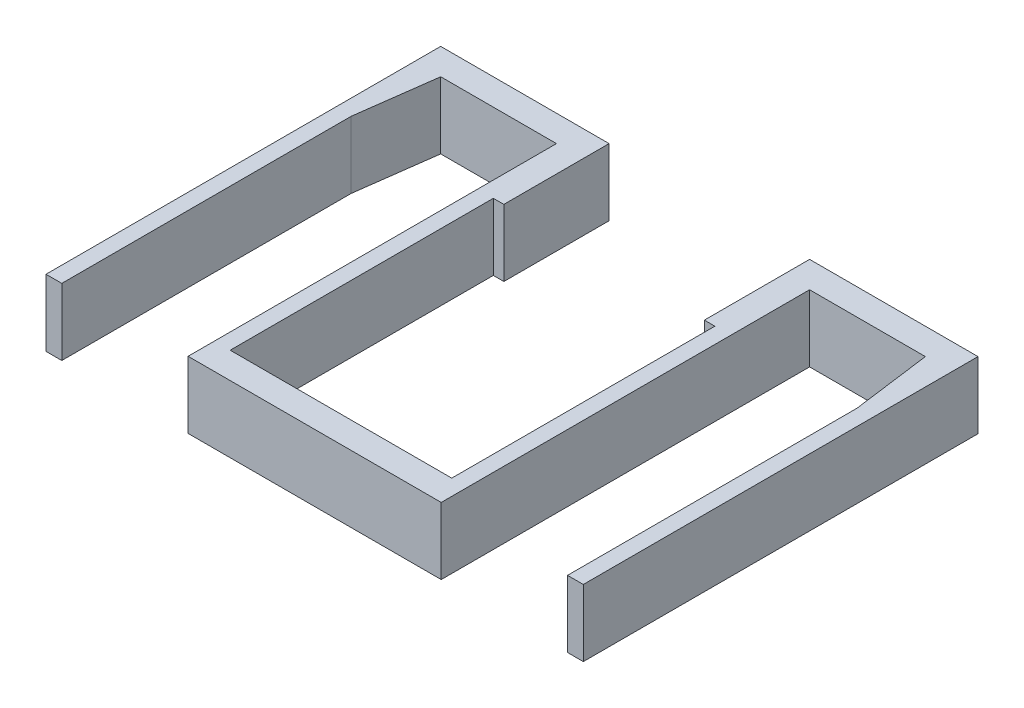
ISO-10303-21;
HEADER;
FILE_DESCRIPTION(('STEP AP214'),'2;1');
FILE_NAME('part.step','',(''),(''),'','','');
FILE_SCHEMA(('AUTOMOTIVE_DESIGN { 1 0 10303 214 1 1 1 1 }'));
ENDSEC;
DATA;
#1=APPLICATION_CONTEXT('core data for automotive mechanical design processes');
#2=APPLICATION_PROTOCOL_DEFINITION('international standard','automotive_design',2000,#1);
#3=PRODUCT_CONTEXT('',#1,'mechanical');
#4=PRODUCT('Part','Part','',(#3));
#5=PRODUCT_RELATED_PRODUCT_CATEGORY('part','',(#4));
#6=PRODUCT_DEFINITION_FORMATION('','',#4);
#7=PRODUCT_DEFINITION_CONTEXT('part definition',#1,'design');
#8=PRODUCT_DEFINITION('design','',#6,#7);
#9=PRODUCT_DEFINITION_SHAPE('','',#8);
#10=(LENGTH_UNIT() NAMED_UNIT(*) SI_UNIT(.MILLI.,.METRE.));
#11=(NAMED_UNIT(*) PLANE_ANGLE_UNIT() SI_UNIT($,.RADIAN.));
#12=(NAMED_UNIT(*) SI_UNIT($,.STERADIAN.) SOLID_ANGLE_UNIT());
#13=UNCERTAINTY_MEASURE_WITH_UNIT(LENGTH_MEASURE(1.E-05),#10,'distance_accuracy_value','');
#14=(GEOMETRIC_REPRESENTATION_CONTEXT(3) GLOBAL_UNCERTAINTY_ASSIGNED_CONTEXT((#13)) GLOBAL_UNIT_ASSIGNED_CONTEXT((#10,
#11,#12)) REPRESENTATION_CONTEXT('',''));
#15=CARTESIAN_POINT('',(0.,0.,0.));
#16=DIRECTION('',(0.,0.,1.));
#17=DIRECTION('',(1.,0.,0.));
#18=AXIS2_PLACEMENT_3D('',#15,#16,#17);
#19=CARTESIAN_POINT('',(-38.1,12.7,-100.));
#20=DIRECTION('',(0.,0.,-1.));
#21=DIRECTION('',(-1.,0.,0.));
#22=AXIS2_PLACEMENT_3D('',#19,#20,#21);
#23=PLANE('',#22);
#24=DIRECTION('',(1.,0.,0.));
#25=VECTOR('',#24,1.);
#26=CARTESIAN_POINT('',(-38.1,-12.7,-100.));
#27=LINE('',#26,#25);
#28=CARTESIAN_POINT('',(-42.1,-12.7,-100.));
#29=VERTEX_POINT('',#28);
#30=CARTESIAN_POINT('',(-38.1,-12.7,-100.));
#31=VERTEX_POINT('',#30);
#32=EDGE_CURVE('E213',#29,#31,#27,.T.);
#33=ORIENTED_EDGE('',*,*,#32,.T.);
#34=DIRECTION('',(0.,-1.,0.));
#35=VECTOR('',#34,1.);
#36=CARTESIAN_POINT('',(-38.1,12.7,-100.));
#37=LINE('',#36,#35);
#38=CARTESIAN_POINT('',(-38.1,12.7,-100.));
#39=VERTEX_POINT('',#38);
#40=EDGE_CURVE('E11',#39,#31,#37,.T.);
#41=ORIENTED_EDGE('',*,*,#40,.F.);
#42=DIRECTION('',(1.,0.,0.));
#43=VECTOR('',#42,1.);
#44=CARTESIAN_POINT('',(-38.1,12.7,-100.));
#45=LINE('',#44,#43);
#46=CARTESIAN_POINT('',(-42.1,12.7,-100.));
#47=VERTEX_POINT('',#46);
#48=EDGE_CURVE('E255',#47,#39,#45,.T.);
#49=ORIENTED_EDGE('',*,*,#48,.F.);
#50=DIRECTION('',(0.,-1.,0.));
#51=VECTOR('',#50,1.);
#52=CARTESIAN_POINT('',(-42.1,12.7,-100.));
#53=LINE('',#52,#51);
#54=EDGE_CURVE('E209',#47,#29,#53,.T.);
#55=ORIENTED_EDGE('',*,*,#54,.T.);
#56=EDGE_LOOP('',(#33,#41,#49,#55));
#57=FACE_BOUND('',#56,.T.);
#58=ADVANCED_FACE('F33',(#57),#23,.F.);
#59=CARTESIAN_POINT('',(-38.1,12.7,-100.));
#60=DIRECTION('',(-1.,0.,0.));
#61=DIRECTION('',(0.,0.,1.));
#62=AXIS2_PLACEMENT_3D('',#59,#60,#61);
#63=PLANE('',#62);
#64=DIRECTION('',(0.,0.,-1.));
#65=VECTOR('',#64,1.);
#66=CARTESIAN_POINT('',(-38.1,-12.7,-100.));
#67=LINE('',#66,#65);
#68=CARTESIAN_POINT('',(-38.1,-12.7,-140.));
#69=VERTEX_POINT('',#68);
#70=EDGE_CURVE('E216',#31,#69,#67,.T.);
#71=ORIENTED_EDGE('',*,*,#70,.T.);
#72=DIRECTION('',(0.,-1.,0.));
#73=VECTOR('',#72,1.);
#74=CARTESIAN_POINT('',(-38.1,12.7,-140.));
#75=LINE('',#74,#73);
#76=CARTESIAN_POINT('',(-38.1,12.7,-140.));
#77=VERTEX_POINT('',#76);
#78=EDGE_CURVE('E41',#77,#69,#75,.T.);
#79=ORIENTED_EDGE('',*,*,#78,.F.);
#80=DIRECTION('',(0.,0.,-1.));
#81=VECTOR('',#80,1.);
#82=CARTESIAN_POINT('',(-38.1,12.7,-100.));
#83=LINE('',#82,#81);
#84=EDGE_CURVE('E134',#39,#77,#83,.T.);
#85=ORIENTED_EDGE('',*,*,#84,.F.);
#86=ORIENTED_EDGE('',*,*,#40,.T.);
#87=EDGE_LOOP('',(#71,#79,#85,#86));
#88=FACE_BOUND('',#87,.T.);
#89=ADVANCED_FACE('F383',(#88),#63,.F.);
#90=CARTESIAN_POINT('',(-38.1,12.7,-140.));
#91=DIRECTION('',(0.,0.,1.));
#92=DIRECTION('',(1.,0.,0.));
#93=AXIS2_PLACEMENT_3D('',#90,#91,#92);
#94=PLANE('',#93);
#95=DIRECTION('',(-1.,0.,0.));
#96=VECTOR('',#95,1.);
#97=CARTESIAN_POINT('',(-38.1,-12.7,-140.));
#98=LINE('',#97,#96);
#99=CARTESIAN_POINT('',(-102.1,-12.7,-140.));
#100=VERTEX_POINT('',#99);
#101=EDGE_CURVE('E218',#69,#100,#98,.T.);
#102=ORIENTED_EDGE('',*,*,#101,.T.);
#103=DIRECTION('',(0.,-1.,0.));
#104=VECTOR('',#103,1.);
#105=CARTESIAN_POINT('',(-102.1,12.7,-140.));
#106=LINE('',#105,#104);
#107=CARTESIAN_POINT('',(-102.1,12.7,-140.));
#108=VERTEX_POINT('',#107);
#109=EDGE_CURVE('E304',#108,#100,#106,.T.);
#110=ORIENTED_EDGE('',*,*,#109,.F.);
#111=DIRECTION('',(-1.,0.,0.));
#112=VECTOR('',#111,1.);
#113=CARTESIAN_POINT('',(-38.1,12.7,-140.));
#114=LINE('',#113,#112);
#115=EDGE_CURVE('E312',#77,#108,#114,.T.);
#116=ORIENTED_EDGE('',*,*,#115,.F.);
#117=ORIENTED_EDGE('',*,*,#78,.T.);
#118=EDGE_LOOP('',(#102,#110,#116,#117));
#119=FACE_BOUND('',#118,.T.);
#120=ADVANCED_FACE('F310',(#119),#94,.F.);
#121=CARTESIAN_POINT('',(-102.1,12.7,-140.));
#122=DIRECTION('',(1.,0.,0.));
#123=DIRECTION('',(0.,0.,-1.));
#124=AXIS2_PLACEMENT_3D('',#121,#122,#123);
#125=PLANE('',#124);
#126=DIRECTION('',(0.,0.,1.));
#127=VECTOR('',#126,1.);
#128=CARTESIAN_POINT('',(-102.1,-12.7,-140.));
#129=LINE('',#128,#127);
#130=CARTESIAN_POINT('',(-102.1,-12.7,10.));
#131=VERTEX_POINT('',#130);
#132=EDGE_CURVE('E220',#100,#131,#129,.T.);
#133=ORIENTED_EDGE('',*,*,#132,.T.);
#134=DIRECTION('',(0.,-1.,0.));
#135=VECTOR('',#134,1.);
#136=CARTESIAN_POINT('',(-102.1,12.7,10.));
#137=LINE('',#136,#135);
#138=CARTESIAN_POINT('',(-102.1,12.7,10.));
#139=VERTEX_POINT('',#138);
#140=EDGE_CURVE('E301',#139,#131,#137,.T.);
#141=ORIENTED_EDGE('',*,*,#140,.F.);
#142=DIRECTION('',(0.,0.,1.));
#143=VECTOR('',#142,1.);
#144=CARTESIAN_POINT('',(-102.1,12.7,-140.));
#145=LINE('',#144,#143);
#146=EDGE_CURVE('E330',#108,#139,#145,.T.);
#147=ORIENTED_EDGE('',*,*,#146,.F.);
#148=ORIENTED_EDGE('',*,*,#109,.T.);
#149=EDGE_LOOP('',(#133,#141,#147,#148));
#150=FACE_BOUND('',#149,.T.);
#151=ADVANCED_FACE('F321',(#150),#125,.F.);
#152=CARTESIAN_POINT('',(-102.1,12.7,10.));
#153=DIRECTION('',(0.,0.,-1.));
#154=DIRECTION('',(-1.,0.,0.));
#155=AXIS2_PLACEMENT_3D('',#152,#153,#154);
#156=PLANE('',#155);
#157=DIRECTION('',(1.,0.,0.));
#158=VECTOR('',#157,1.);
#159=CARTESIAN_POINT('',(-102.1,-12.7,10.));
#160=LINE('',#159,#158);
#161=CARTESIAN_POINT('',(-96.1,-12.7,10.));
#162=VERTEX_POINT('',#161);
#163=EDGE_CURVE('E222',#131,#162,#160,.T.);
#164=ORIENTED_EDGE('',*,*,#163,.T.);
#165=DIRECTION('',(0.,-1.,0.));
#166=VECTOR('',#165,1.);
#167=CARTESIAN_POINT('',(-96.1,12.7,10.));
#168=LINE('',#167,#166);
#169=CARTESIAN_POINT('',(-96.1,12.7,10.));
#170=VERTEX_POINT('',#169);
#171=EDGE_CURVE('E298',#170,#162,#168,.T.);
#172=ORIENTED_EDGE('',*,*,#171,.F.);
#173=DIRECTION('',(1.,0.,0.));
#174=VECTOR('',#173,1.);
#175=CARTESIAN_POINT('',(-102.1,12.7,10.));
#176=LINE('',#175,#174);
#177=EDGE_CURVE('E327',#139,#170,#176,.T.);
#178=ORIENTED_EDGE('',*,*,#177,.F.);
#179=ORIENTED_EDGE('',*,*,#140,.T.);
#180=EDGE_LOOP('',(#164,#172,#178,#179));
#181=FACE_BOUND('',#180,.T.);
#182=ADVANCED_FACE('F325',(#181),#156,.F.);
#183=CARTESIAN_POINT('',(-96.1,12.7,-99.9999999999999));
#184=DIRECTION('',(-1.,0.,0.));
#185=DIRECTION('',(0.,0.,1.));
#186=AXIS2_PLACEMENT_3D('',#183,#184,#185);
#187=PLANE('',#186);
#188=DIRECTION('',(0.,0.,-1.));
#189=VECTOR('',#188,1.);
#190=CARTESIAN_POINT('',(-96.1,-12.7,-99.9999999999999));
#191=LINE('',#190,#189);
#192=CARTESIAN_POINT('',(-96.1,-12.7,-99.9999999999999));
#193=VERTEX_POINT('',#192);
#194=EDGE_CURVE('E224',#162,#193,#191,.T.);
#195=ORIENTED_EDGE('',*,*,#194,.T.);
#196=DIRECTION('',(0.,-1.,0.));
#197=VECTOR('',#196,1.);
#198=CARTESIAN_POINT('',(-96.1,12.7,-99.9999999999999));
#199=LINE('',#198,#197);
#200=CARTESIAN_POINT('',(-96.1,12.7,-99.9999999999999));
#201=VERTEX_POINT('',#200);
#202=EDGE_CURVE('E295',#201,#193,#199,.T.);
#203=ORIENTED_EDGE('',*,*,#202,.F.);
#204=DIRECTION('',(0.,0.,-1.));
#205=VECTOR('',#204,1.);
#206=CARTESIAN_POINT('',(-96.1,12.7,-99.9999999999999));
#207=LINE('',#206,#205);
#208=EDGE_CURVE('E329',#170,#201,#207,.T.);
#209=ORIENTED_EDGE('',*,*,#208,.F.);
#210=ORIENTED_EDGE('',*,*,#171,.T.);
#211=EDGE_LOOP('',(#195,#203,#209,#210));
#212=FACE_BOUND('',#211,.T.);
#213=ADVANCED_FACE('F396',(#212),#187,.F.);
#214=CARTESIAN_POINT('',(-92.1,12.7,-130.));
#215=DIRECTION('',(-0.991227900682635,0.,-0.132163720091017));
#216=DIRECTION('',(-0.132163720091017,0.,0.991227900682635));
#217=AXIS2_PLACEMENT_3D('',#214,#215,#216);
#218=PLANE('',#217);
#219=DIRECTION('',(0.132163720091017,0.,-0.991227900682635));
#220=VECTOR('',#219,1.);
#221=CARTESIAN_POINT('',(-92.1,-12.7,-130.));
#222=LINE('',#221,#220);
#223=CARTESIAN_POINT('',(-92.1,-12.7,-130.));
#224=VERTEX_POINT('',#223);
#225=EDGE_CURVE('E226',#193,#224,#222,.T.);
#226=ORIENTED_EDGE('',*,*,#225,.T.);
#227=DIRECTION('',(0.,-1.,0.));
#228=VECTOR('',#227,1.);
#229=CARTESIAN_POINT('',(-92.1,12.7,-130.));
#230=LINE('',#229,#228);
#231=CARTESIAN_POINT('',(-92.1,12.7,-130.));
#232=VERTEX_POINT('',#231);
#233=EDGE_CURVE('E292',#232,#224,#230,.T.);
#234=ORIENTED_EDGE('',*,*,#233,.F.);
#235=DIRECTION('',(0.132163720091017,0.,-0.991227900682635));
#236=VECTOR('',#235,1.);
#237=CARTESIAN_POINT('',(-92.1,12.7,-130.));
#238=LINE('',#237,#236);
#239=EDGE_CURVE('E332',#201,#232,#238,.T.);
#240=ORIENTED_EDGE('',*,*,#239,.F.);
#241=ORIENTED_EDGE('',*,*,#202,.T.);
#242=EDGE_LOOP('',(#226,#234,#240,#241));
#243=FACE_BOUND('',#242,.T.);
#244=ADVANCED_FACE('F399',(#243),#218,.F.);
#245=CARTESIAN_POINT('',(-92.1,12.7,-130.));
#246=DIRECTION('',(0.,0.,-1.));
#247=DIRECTION('',(-1.,0.,0.));
#248=AXIS2_PLACEMENT_3D('',#245,#246,#247);
#249=PLANE('',#248);
#250=DIRECTION('',(1.,0.,0.));
#251=VECTOR('',#250,1.);
#252=CARTESIAN_POINT('',(-92.1,-12.7,-130.));
#253=LINE('',#252,#251);
#254=CARTESIAN_POINT('',(-48.1,-12.7,-130.));
#255=VERTEX_POINT('',#254);
#256=EDGE_CURVE('E228',#224,#255,#253,.T.);
#257=ORIENTED_EDGE('',*,*,#256,.T.);
#258=DIRECTION('',(0.,-1.,0.));
#259=VECTOR('',#258,1.);
#260=CARTESIAN_POINT('',(-48.1,12.7,-130.));
#261=LINE('',#260,#259);
#262=CARTESIAN_POINT('',(-48.1,12.7,-130.));
#263=VERTEX_POINT('',#262);
#264=EDGE_CURVE('E289',#263,#255,#261,.T.);
#265=ORIENTED_EDGE('',*,*,#264,.F.);
#266=DIRECTION('',(1.,0.,0.));
#267=VECTOR('',#266,1.);
#268=CARTESIAN_POINT('',(-92.1,12.7,-130.));
#269=LINE('',#268,#267);
#270=EDGE_CURVE('E338',#232,#263,#269,.T.);
#271=ORIENTED_EDGE('',*,*,#270,.F.);
#272=ORIENTED_EDGE('',*,*,#233,.T.);
#273=EDGE_LOOP('',(#257,#265,#271,#272));
#274=FACE_BOUND('',#273,.T.);
#275=ADVANCED_FACE('F403',(#274),#249,.F.);
#276=CARTESIAN_POINT('',(-48.1,12.7,-130.));
#277=DIRECTION('',(1.,0.,0.));
#278=DIRECTION('',(0.,0.,-1.));
#279=AXIS2_PLACEMENT_3D('',#276,#277,#278);
#280=PLANE('',#279);
#281=DIRECTION('',(0.,0.,1.));
#282=VECTOR('',#281,1.);
#283=CARTESIAN_POINT('',(-48.1,-12.7,-130.));
#284=LINE('',#283,#282);
#285=CARTESIAN_POINT('',(-48.1,-12.7,10.));
#286=VERTEX_POINT('',#285);
#287=EDGE_CURVE('E230',#255,#286,#284,.T.);
#288=ORIENTED_EDGE('',*,*,#287,.T.);
#289=DIRECTION('',(0.,-1.,0.));
#290=VECTOR('',#289,1.);
#291=CARTESIAN_POINT('',(-48.1,12.7,10.));
#292=LINE('',#291,#290);
#293=CARTESIAN_POINT('',(-48.1,12.7,10.));
#294=VERTEX_POINT('',#293);
#295=EDGE_CURVE('E286',#294,#286,#292,.T.);
#296=ORIENTED_EDGE('',*,*,#295,.F.);
#297=DIRECTION('',(0.,0.,1.));
#298=VECTOR('',#297,1.);
#299=CARTESIAN_POINT('',(-48.1,12.7,-130.));
#300=LINE('',#299,#298);
#301=EDGE_CURVE('E340',#263,#294,#300,.T.);
#302=ORIENTED_EDGE('',*,*,#301,.F.);
#303=ORIENTED_EDGE('',*,*,#264,.T.);
#304=EDGE_LOOP('',(#288,#296,#302,#303));
#305=FACE_BOUND('',#304,.T.);
#306=ADVANCED_FACE('F407',(#305),#280,.F.);
#307=CARTESIAN_POINT('',(48.1,12.7,10.));
#308=DIRECTION('',(0.,0.,-1.));
#309=DIRECTION('',(-1.,0.,0.));
#310=AXIS2_PLACEMENT_3D('',#307,#308,#309);
#311=PLANE('',#310);
#312=DIRECTION('',(1.,0.,0.));
#313=VECTOR('',#312,1.);
#314=CARTESIAN_POINT('',(48.1,-12.7,10.));
#315=LINE('',#314,#313);
#316=CARTESIAN_POINT('',(48.1,-12.7,10.));
#317=VERTEX_POINT('',#316);
#318=EDGE_CURVE('E232',#286,#317,#315,.T.);
#319=ORIENTED_EDGE('',*,*,#318,.T.);
#320=DIRECTION('',(0.,-1.,0.));
#321=VECTOR('',#320,1.);
#322=CARTESIAN_POINT('',(48.1,12.7,10.));
#323=LINE('',#322,#321);
#324=CARTESIAN_POINT('',(48.1,12.7,10.));
#325=VERTEX_POINT('',#324);
#326=EDGE_CURVE('E283',#325,#317,#323,.T.);
#327=ORIENTED_EDGE('',*,*,#326,.F.);
#328=DIRECTION('',(1.,0.,0.));
#329=VECTOR('',#328,1.);
#330=CARTESIAN_POINT('',(48.1,12.7,10.));
#331=LINE('',#330,#329);
#332=EDGE_CURVE('E342',#294,#325,#331,.T.);
#333=ORIENTED_EDGE('',*,*,#332,.F.);
#334=ORIENTED_EDGE('',*,*,#295,.T.);
#335=EDGE_LOOP('',(#319,#327,#333,#334));
#336=FACE_BOUND('',#335,.T.);
#337=ADVANCED_FACE('F411',(#336),#311,.F.);
#338=CARTESIAN_POINT('',(48.1,12.7,-130.));
#339=DIRECTION('',(-1.,0.,0.));
#340=DIRECTION('',(0.,0.,1.));
#341=AXIS2_PLACEMENT_3D('',#338,#339,#340);
#342=PLANE('',#341);
#343=DIRECTION('',(0.,0.,-1.));
#344=VECTOR('',#343,1.);
#345=CARTESIAN_POINT('',(48.1,-12.7,-130.));
#346=LINE('',#345,#344);
#347=CARTESIAN_POINT('',(48.1,-12.7,-130.));
#348=VERTEX_POINT('',#347);
#349=EDGE_CURVE('E234',#317,#348,#346,.T.);
#350=ORIENTED_EDGE('',*,*,#349,.T.);
#351=DIRECTION('',(0.,-1.,0.));
#352=VECTOR('',#351,1.);
#353=CARTESIAN_POINT('',(48.1,12.7,-130.));
#354=LINE('',#353,#352);
#355=CARTESIAN_POINT('',(48.1,12.7,-130.));
#356=VERTEX_POINT('',#355);
#357=EDGE_CURVE('E280',#356,#348,#354,.T.);
#358=ORIENTED_EDGE('',*,*,#357,.F.);
#359=DIRECTION('',(0.,0.,-1.));
#360=VECTOR('',#359,1.);
#361=CARTESIAN_POINT('',(48.1,12.7,-130.));
#362=LINE('',#361,#360);
#363=EDGE_CURVE('E344',#325,#356,#362,.T.);
#364=ORIENTED_EDGE('',*,*,#363,.F.);
#365=ORIENTED_EDGE('',*,*,#326,.T.);
#366=EDGE_LOOP('',(#350,#358,#364,#365));
#367=FACE_BOUND('',#366,.T.);
#368=ADVANCED_FACE('F415',(#367),#342,.F.);
#369=CARTESIAN_POINT('',(92.1,12.7,-130.));
#370=DIRECTION('',(0.,0.,-1.));
#371=DIRECTION('',(-1.,0.,0.));
#372=AXIS2_PLACEMENT_3D('',#369,#370,#371);
#373=PLANE('',#372);
#374=DIRECTION('',(1.,0.,0.));
#375=VECTOR('',#374,1.);
#376=CARTESIAN_POINT('',(92.1,-12.7,-130.));
#377=LINE('',#376,#375);
#378=CARTESIAN_POINT('',(92.1,-12.7,-130.));
#379=VERTEX_POINT('',#378);
#380=EDGE_CURVE('E236',#348,#379,#377,.T.);
#381=ORIENTED_EDGE('',*,*,#380,.T.);
#382=DIRECTION('',(0.,-1.,0.));
#383=VECTOR('',#382,1.);
#384=CARTESIAN_POINT('',(92.1,12.7,-130.));
#385=LINE('',#384,#383);
#386=CARTESIAN_POINT('',(92.1,12.7,-130.));
#387=VERTEX_POINT('',#386);
#388=EDGE_CURVE('E277',#387,#379,#385,.T.);
#389=ORIENTED_EDGE('',*,*,#388,.F.);
#390=DIRECTION('',(1.,0.,0.));
#391=VECTOR('',#390,1.);
#392=CARTESIAN_POINT('',(92.1,12.7,-130.));
#393=LINE('',#392,#391);
#394=EDGE_CURVE('E346',#356,#387,#393,.T.);
#395=ORIENTED_EDGE('',*,*,#394,.F.);
#396=ORIENTED_EDGE('',*,*,#357,.T.);
#397=EDGE_LOOP('',(#381,#389,#395,#396));
#398=FACE_BOUND('',#397,.T.);
#399=ADVANCED_FACE('F419',(#398),#373,.F.);
#400=CARTESIAN_POINT('',(92.1,12.7,-130.));
#401=DIRECTION('',(0.991227900682635,0.,-0.132163720091017));
#402=DIRECTION('',(-0.132163720091017,0.,-0.991227900682635));
#403=AXIS2_PLACEMENT_3D('',#400,#401,#402);
#404=PLANE('',#403);
#405=DIRECTION('',(0.132163720091017,0.,0.991227900682635));
#406=VECTOR('',#405,1.);
#407=CARTESIAN_POINT('',(92.1,-12.7,-130.));
#408=LINE('',#407,#406);
#409=CARTESIAN_POINT('',(96.1,-12.7,-99.9999999999999));
#410=VERTEX_POINT('',#409);
#411=EDGE_CURVE('E238',#379,#410,#408,.T.);
#412=ORIENTED_EDGE('',*,*,#411,.T.);
#413=DIRECTION('',(0.,-1.,0.));
#414=VECTOR('',#413,1.);
#415=CARTESIAN_POINT('',(96.1,12.7,-99.9999999999999));
#416=LINE('',#415,#414);
#417=CARTESIAN_POINT('',(96.1,12.7,-99.9999999999999));
#418=VERTEX_POINT('',#417);
#419=EDGE_CURVE('E274',#418,#410,#416,.T.);
#420=ORIENTED_EDGE('',*,*,#419,.F.);
#421=DIRECTION('',(0.132163720091017,0.,0.991227900682635));
#422=VECTOR('',#421,1.);
#423=CARTESIAN_POINT('',(92.1,12.7,-130.));
#424=LINE('',#423,#422);
#425=EDGE_CURVE('E348',#387,#418,#424,.T.);
#426=ORIENTED_EDGE('',*,*,#425,.F.);
#427=ORIENTED_EDGE('',*,*,#388,.T.);
#428=EDGE_LOOP('',(#412,#420,#426,#427));
#429=FACE_BOUND('',#428,.T.);
#430=ADVANCED_FACE('F423',(#429),#404,.F.);
#431=CARTESIAN_POINT('',(96.1,12.7,-99.9999999999999));
#432=DIRECTION('',(1.,0.,0.));
#433=DIRECTION('',(0.,0.,-1.));
#434=AXIS2_PLACEMENT_3D('',#431,#432,#433);
#435=PLANE('',#434);
#436=DIRECTION('',(0.,0.,1.));
#437=VECTOR('',#436,1.);
#438=CARTESIAN_POINT('',(96.1,-12.7,-99.9999999999999));
#439=LINE('',#438,#437);
#440=CARTESIAN_POINT('',(96.1,-12.7,10.));
#441=VERTEX_POINT('',#440);
#442=EDGE_CURVE('E240',#410,#441,#439,.T.);
#443=ORIENTED_EDGE('',*,*,#442,.T.);
#444=DIRECTION('',(0.,-1.,0.));
#445=VECTOR('',#444,1.);
#446=CARTESIAN_POINT('',(96.1,12.7,10.));
#447=LINE('',#446,#445);
#448=CARTESIAN_POINT('',(96.1,12.7,10.));
#449=VERTEX_POINT('',#448);
#450=EDGE_CURVE('E271',#449,#441,#447,.T.);
#451=ORIENTED_EDGE('',*,*,#450,.F.);
#452=DIRECTION('',(0.,0.,1.));
#453=VECTOR('',#452,1.);
#454=CARTESIAN_POINT('',(96.1,12.7,-99.9999999999999));
#455=LINE('',#454,#453);
#456=EDGE_CURVE('E350',#418,#449,#455,.T.);
#457=ORIENTED_EDGE('',*,*,#456,.F.);
#458=ORIENTED_EDGE('',*,*,#419,.T.);
#459=EDGE_LOOP('',(#443,#451,#457,#458));
#460=FACE_BOUND('',#459,.T.);
#461=ADVANCED_FACE('F427',(#460),#435,.F.);
#462=CARTESIAN_POINT('',(96.1,12.7,10.));
#463=DIRECTION('',(0.,0.,-1.));
#464=DIRECTION('',(-1.,0.,0.));
#465=AXIS2_PLACEMENT_3D('',#462,#463,#464);
#466=PLANE('',#465);
#467=DIRECTION('',(1.,0.,0.));
#468=VECTOR('',#467,1.);
#469=CARTESIAN_POINT('',(96.1,-12.7,10.));
#470=LINE('',#469,#468);
#471=CARTESIAN_POINT('',(102.1,-12.7,10.));
#472=VERTEX_POINT('',#471);
#473=EDGE_CURVE('E242',#441,#472,#470,.T.);
#474=ORIENTED_EDGE('',*,*,#473,.T.);
#475=DIRECTION('',(0.,-1.,0.));
#476=VECTOR('',#475,1.);
#477=CARTESIAN_POINT('',(102.1,12.7,10.));
#478=LINE('',#477,#476);
#479=CARTESIAN_POINT('',(102.1,12.7,10.));
#480=VERTEX_POINT('',#479);
#481=EDGE_CURVE('E268',#480,#472,#478,.T.);
#482=ORIENTED_EDGE('',*,*,#481,.F.);
#483=DIRECTION('',(1.,0.,0.));
#484=VECTOR('',#483,1.);
#485=CARTESIAN_POINT('',(96.1,12.7,10.));
#486=LINE('',#485,#484);
#487=EDGE_CURVE('E352',#449,#480,#486,.T.);
#488=ORIENTED_EDGE('',*,*,#487,.F.);
#489=ORIENTED_EDGE('',*,*,#450,.T.);
#490=EDGE_LOOP('',(#474,#482,#488,#489));
#491=FACE_BOUND('',#490,.T.);
#492=ADVANCED_FACE('F431',(#491),#466,.F.);
#493=CARTESIAN_POINT('',(102.1,12.7,-140.));
#494=DIRECTION('',(-1.,0.,0.));
#495=DIRECTION('',(0.,0.,1.));
#496=AXIS2_PLACEMENT_3D('',#493,#494,#495);
#497=PLANE('',#496);
#498=DIRECTION('',(0.,0.,-1.));
#499=VECTOR('',#498,1.);
#500=CARTESIAN_POINT('',(102.1,-12.7,-140.));
#501=LINE('',#500,#499);
#502=CARTESIAN_POINT('',(102.1,-12.7,-140.));
#503=VERTEX_POINT('',#502);
#504=EDGE_CURVE('E244',#472,#503,#501,.T.);
#505=ORIENTED_EDGE('',*,*,#504,.T.);
#506=DIRECTION('',(0.,-1.,0.));
#507=VECTOR('',#506,1.);
#508=CARTESIAN_POINT('',(102.1,12.7,-140.));
#509=LINE('',#508,#507);
#510=CARTESIAN_POINT('',(102.1,12.7,-140.));
#511=VERTEX_POINT('',#510);
#512=EDGE_CURVE('E265',#511,#503,#509,.T.);
#513=ORIENTED_EDGE('',*,*,#512,.F.);
#514=DIRECTION('',(0.,0.,-1.));
#515=VECTOR('',#514,1.);
#516=CARTESIAN_POINT('',(102.1,12.7,-140.));
#517=LINE('',#516,#515);
#518=EDGE_CURVE('E354',#480,#511,#517,.T.);
#519=ORIENTED_EDGE('',*,*,#518,.F.);
#520=ORIENTED_EDGE('',*,*,#481,.T.);
#521=EDGE_LOOP('',(#505,#513,#519,#520));
#522=FACE_BOUND('',#521,.T.);
#523=ADVANCED_FACE('F435',(#522),#497,.F.);
#524=CARTESIAN_POINT('',(38.1,12.7,-140.));
#525=DIRECTION('',(0.,0.,1.));
#526=DIRECTION('',(1.,0.,0.));
#527=AXIS2_PLACEMENT_3D('',#524,#525,#526);
#528=PLANE('',#527);
#529=DIRECTION('',(-1.,0.,0.));
#530=VECTOR('',#529,1.);
#531=CARTESIAN_POINT('',(38.1,-12.7,-140.));
#532=LINE('',#531,#530);
#533=CARTESIAN_POINT('',(38.1,-12.7,-140.));
#534=VERTEX_POINT('',#533);
#535=EDGE_CURVE('E246',#503,#534,#532,.T.);
#536=ORIENTED_EDGE('',*,*,#535,.T.);
#537=DIRECTION('',(0.,-1.,0.));
#538=VECTOR('',#537,1.);
#539=CARTESIAN_POINT('',(38.1,12.7,-140.));
#540=LINE('',#539,#538);
#541=CARTESIAN_POINT('',(38.1,12.7,-140.));
#542=VERTEX_POINT('',#541);
#543=EDGE_CURVE('E262',#542,#534,#540,.T.);
#544=ORIENTED_EDGE('',*,*,#543,.F.);
#545=DIRECTION('',(-1.,0.,0.));
#546=VECTOR('',#545,1.);
#547=CARTESIAN_POINT('',(38.1,12.7,-140.));
#548=LINE('',#547,#546);
#549=EDGE_CURVE('E356',#511,#542,#548,.T.);
#550=ORIENTED_EDGE('',*,*,#549,.F.);
#551=ORIENTED_EDGE('',*,*,#512,.T.);
#552=EDGE_LOOP('',(#536,#544,#550,#551));
#553=FACE_BOUND('',#552,.T.);
#554=ADVANCED_FACE('F439',(#553),#528,.F.);
#555=CARTESIAN_POINT('',(38.1,12.7,-100.));
#556=DIRECTION('',(1.,0.,0.));
#557=DIRECTION('',(0.,0.,-1.));
#558=AXIS2_PLACEMENT_3D('',#555,#556,#557);
#559=PLANE('',#558);
#560=DIRECTION('',(0.,0.,1.));
#561=VECTOR('',#560,1.);
#562=CARTESIAN_POINT('',(38.1,-12.7,-100.));
#563=LINE('',#562,#561);
#564=CARTESIAN_POINT('',(38.1,-12.7,-100.));
#565=VERTEX_POINT('',#564);
#566=EDGE_CURVE('E248',#534,#565,#563,.T.);
#567=ORIENTED_EDGE('',*,*,#566,.T.);
#568=DIRECTION('',(0.,-1.,0.));
#569=VECTOR('',#568,1.);
#570=CARTESIAN_POINT('',(38.1,12.7,-100.));
#571=LINE('',#570,#569);
#572=CARTESIAN_POINT('',(38.1,12.7,-100.));
#573=VERTEX_POINT('',#572);
#574=EDGE_CURVE('E259',#573,#565,#571,.T.);
#575=ORIENTED_EDGE('',*,*,#574,.F.);
#576=DIRECTION('',(0.,0.,1.));
#577=VECTOR('',#576,1.);
#578=CARTESIAN_POINT('',(38.1,12.7,-100.));
#579=LINE('',#578,#577);
#580=EDGE_CURVE('E358',#542,#573,#579,.T.);
#581=ORIENTED_EDGE('',*,*,#580,.F.);
#582=ORIENTED_EDGE('',*,*,#543,.T.);
#583=EDGE_LOOP('',(#567,#575,#581,#582));
#584=FACE_BOUND('',#583,.T.);
#585=ADVANCED_FACE('F364',(#584),#559,.F.);
#586=CARTESIAN_POINT('',(38.1,12.7,-100.));
#587=DIRECTION('',(0.,0.,-1.));
#588=DIRECTION('',(-1.,0.,0.));
#589=AXIS2_PLACEMENT_3D('',#586,#587,#588);
#590=PLANE('',#589);
#591=DIRECTION('',(1.,0.,0.));
#592=VECTOR('',#591,1.);
#593=CARTESIAN_POINT('',(38.1,-12.7,-100.));
#594=LINE('',#593,#592);
#595=CARTESIAN_POINT('',(42.1,-12.7,-100.));
#596=VERTEX_POINT('',#595);
#597=EDGE_CURVE('E250',#565,#596,#594,.T.);
#598=ORIENTED_EDGE('',*,*,#597,.T.);
#599=DIRECTION('',(0.,-1.,0.));
#600=VECTOR('',#599,1.);
#601=CARTESIAN_POINT('',(42.1,12.7,-100.));
#602=LINE('',#601,#600);
#603=CARTESIAN_POINT('',(42.1,12.7,-100.));
#604=VERTEX_POINT('',#603);
#605=EDGE_CURVE('E204',#604,#596,#602,.T.);
#606=ORIENTED_EDGE('',*,*,#605,.F.);
#607=DIRECTION('',(1.,0.,0.));
#608=VECTOR('',#607,1.);
#609=CARTESIAN_POINT('',(38.1,12.7,-100.));
#610=LINE('',#609,#608);
#611=EDGE_CURVE('E195',#573,#604,#610,.T.);
#612=ORIENTED_EDGE('',*,*,#611,.F.);
#613=ORIENTED_EDGE('',*,*,#574,.T.);
#614=EDGE_LOOP('',(#598,#606,#612,#613));
#615=FACE_BOUND('',#614,.T.);
#616=ADVANCED_FACE('F368',(#615),#590,.F.);
#617=CARTESIAN_POINT('',(42.1,12.7,0.));
#618=DIRECTION('',(1.,0.,0.));
#619=DIRECTION('',(0.,0.,-1.));
#620=AXIS2_PLACEMENT_3D('',#617,#618,#619);
#621=PLANE('',#620);
#622=DIRECTION('',(0.,0.,1.));
#623=VECTOR('',#622,1.);
#624=CARTESIAN_POINT('',(42.1,-12.7,0.));
#625=LINE('',#624,#623);
#626=CARTESIAN_POINT('',(42.1,-12.7,0.));
#627=VERTEX_POINT('',#626);
#628=EDGE_CURVE('E203',#596,#627,#625,.T.);
#629=ORIENTED_EDGE('',*,*,#628,.T.);
#630=DIRECTION('',(0.,-1.,0.));
#631=VECTOR('',#630,1.);
#632=CARTESIAN_POINT('',(42.1,12.7,0.));
#633=LINE('',#632,#631);
#634=CARTESIAN_POINT('',(42.1,12.7,0.));
#635=VERTEX_POINT('',#634);
#636=EDGE_CURVE('E200',#635,#627,#633,.T.);
#637=ORIENTED_EDGE('',*,*,#636,.F.);
#638=DIRECTION('',(0.,0.,1.));
#639=VECTOR('',#638,1.);
#640=CARTESIAN_POINT('',(42.1,12.7,0.));
#641=LINE('',#640,#639);
#642=EDGE_CURVE('E189',#604,#635,#641,.T.);
#643=ORIENTED_EDGE('',*,*,#642,.F.);
#644=ORIENTED_EDGE('',*,*,#605,.T.);
#645=EDGE_LOOP('',(#629,#637,#643,#644));
#646=FACE_BOUND('',#645,.T.);
#647=ADVANCED_FACE('F201',(#646),#621,.F.);
#648=CARTESIAN_POINT('',(-42.1,12.7,0.));
#649=DIRECTION('',(0.,0.,1.));
#650=DIRECTION('',(1.,0.,0.));
#651=AXIS2_PLACEMENT_3D('',#648,#649,#650);
#652=PLANE('',#651);
#653=DIRECTION('',(-1.,0.,0.));
#654=VECTOR('',#653,1.);
#655=CARTESIAN_POINT('',(-42.1,-12.7,0.));
#656=LINE('',#655,#654);
#657=CARTESIAN_POINT('',(-42.1,-12.7,0.));
#658=VERTEX_POINT('',#657);
#659=EDGE_CURVE('E120',#627,#658,#656,.T.);
#660=ORIENTED_EDGE('',*,*,#659,.T.);
#661=DIRECTION('',(0.,-1.,0.));
#662=VECTOR('',#661,1.);
#663=CARTESIAN_POINT('',(-42.1,12.7,0.));
#664=LINE('',#663,#662);
#665=CARTESIAN_POINT('',(-42.1,12.7,0.));
#666=VERTEX_POINT('',#665);
#667=EDGE_CURVE('E205',#666,#658,#664,.T.);
#668=ORIENTED_EDGE('',*,*,#667,.F.);
#669=DIRECTION('',(-1.,0.,0.));
#670=VECTOR('',#669,1.);
#671=CARTESIAN_POINT('',(-42.1,12.7,0.));
#672=LINE('',#671,#670);
#673=EDGE_CURVE('E193',#635,#666,#672,.T.);
#674=ORIENTED_EDGE('',*,*,#673,.F.);
#675=ORIENTED_EDGE('',*,*,#636,.T.);
#676=EDGE_LOOP('',(#660,#668,#674,#675));
#677=FACE_BOUND('',#676,.T.);
#678=ADVANCED_FACE('F207',(#677),#652,.F.);
#679=CARTESIAN_POINT('',(-42.1,12.7,0.));
#680=DIRECTION('',(-1.,0.,0.));
#681=DIRECTION('',(0.,0.,1.));
#682=AXIS2_PLACEMENT_3D('',#679,#680,#681);
#683=PLANE('',#682);
#684=DIRECTION('',(0.,0.,-1.));
#685=VECTOR('',#684,1.);
#686=CARTESIAN_POINT('',(-42.1,-12.7,0.));
#687=LINE('',#686,#685);
#688=EDGE_CURVE('E126',#658,#29,#687,.T.);
#689=ORIENTED_EDGE('',*,*,#688,.T.);
#690=ORIENTED_EDGE('',*,*,#54,.F.);
#691=DIRECTION('',(0.,0.,-1.));
#692=VECTOR('',#691,1.);
#693=CARTESIAN_POINT('',(-42.1,12.7,0.));
#694=LINE('',#693,#692);
#695=EDGE_CURVE('E49',#666,#47,#694,.T.);
#696=ORIENTED_EDGE('',*,*,#695,.F.);
#697=ORIENTED_EDGE('',*,*,#667,.T.);
#698=EDGE_LOOP('',(#689,#690,#696,#697));
#699=FACE_BOUND('',#698,.T.);
#700=ADVANCED_FACE('F372',(#699),#683,.F.);
#701=CARTESIAN_POINT('',(0.,12.7,0.));
#702=DIRECTION('',(0.,-1.,0.));
#703=DIRECTION('',(0.,0.,-1.));
#704=AXIS2_PLACEMENT_3D('',#701,#702,#703);
#705=PLANE('',#704);
#706=ORIENTED_EDGE('',*,*,#48,.T.);
#707=ORIENTED_EDGE('',*,*,#84,.T.);
#708=ORIENTED_EDGE('',*,*,#115,.T.);
#709=ORIENTED_EDGE('',*,*,#146,.T.);
#710=ORIENTED_EDGE('',*,*,#177,.T.);
#711=ORIENTED_EDGE('',*,*,#208,.T.);
#712=ORIENTED_EDGE('',*,*,#239,.T.);
#713=ORIENTED_EDGE('',*,*,#270,.T.);
#714=ORIENTED_EDGE('',*,*,#301,.T.);
#715=ORIENTED_EDGE('',*,*,#332,.T.);
#716=ORIENTED_EDGE('',*,*,#363,.T.);
#717=ORIENTED_EDGE('',*,*,#394,.T.);
#718=ORIENTED_EDGE('',*,*,#425,.T.);
#719=ORIENTED_EDGE('',*,*,#456,.T.);
#720=ORIENTED_EDGE('',*,*,#487,.T.);
#721=ORIENTED_EDGE('',*,*,#518,.T.);
#722=ORIENTED_EDGE('',*,*,#549,.T.);
#723=ORIENTED_EDGE('',*,*,#580,.T.);
#724=ORIENTED_EDGE('',*,*,#611,.T.);
#725=ORIENTED_EDGE('',*,*,#642,.T.);
#726=ORIENTED_EDGE('',*,*,#673,.T.);
#727=ORIENTED_EDGE('',*,*,#695,.T.);
#728=EDGE_LOOP('',(#706,#707,#708,#709,#710,#711,#712,#713,#714,#715,#716,#717,#718,#719,#720,
#721,#722,#723,#724,#725,#726,#727));
#729=FACE_BOUND('',#728,.T.);
#730=ADVANCED_FACE('F191',(#729),#705,.F.);
#731=CARTESIAN_POINT('',(0.,-12.7,0.));
#732=DIRECTION('',(0.,-1.,0.));
#733=DIRECTION('',(0.,0.,-1.));
#734=AXIS2_PLACEMENT_3D('',#731,#732,#733);
#735=PLANE('',#734);
#736=ORIENTED_EDGE('',*,*,#32,.F.);
#737=ORIENTED_EDGE('',*,*,#688,.F.);
#738=ORIENTED_EDGE('',*,*,#659,.F.);
#739=ORIENTED_EDGE('',*,*,#628,.F.);
#740=ORIENTED_EDGE('',*,*,#597,.F.);
#741=ORIENTED_EDGE('',*,*,#566,.F.);
#742=ORIENTED_EDGE('',*,*,#535,.F.);
#743=ORIENTED_EDGE('',*,*,#504,.F.);
#744=ORIENTED_EDGE('',*,*,#473,.F.);
#745=ORIENTED_EDGE('',*,*,#442,.F.);
#746=ORIENTED_EDGE('',*,*,#411,.F.);
#747=ORIENTED_EDGE('',*,*,#380,.F.);
#748=ORIENTED_EDGE('',*,*,#349,.F.);
#749=ORIENTED_EDGE('',*,*,#318,.F.);
#750=ORIENTED_EDGE('',*,*,#287,.F.);
#751=ORIENTED_EDGE('',*,*,#256,.F.);
#752=ORIENTED_EDGE('',*,*,#225,.F.);
#753=ORIENTED_EDGE('',*,*,#194,.F.);
#754=ORIENTED_EDGE('',*,*,#163,.F.);
#755=ORIENTED_EDGE('',*,*,#132,.F.);
#756=ORIENTED_EDGE('',*,*,#101,.F.);
#757=ORIENTED_EDGE('',*,*,#70,.F.);
#758=EDGE_LOOP('',(#736,#737,#738,#739,#740,#741,#742,#743,#744,#745,#746,#747,#748,#749,#750,
#751,#752,#753,#754,#755,#756,#757));
#759=FACE_BOUND('',#758,.T.);
#760=ADVANCED_FACE('F316',(#759),#735,.T.);
#761=CLOSED_SHELL('',(#58,#89,#120,#151,#182,#213,#244,#275,#306,#337,#368,#399,#430,#461,#492,
#523,#554,#585,#616,#647,#678,#700,#730,#760));
#762=MANIFOLD_SOLID_BREP('B2',#761);
#763=ADVANCED_BREP_SHAPE_REPRESENTATION('',(#18,#762),#14);
#764=SHAPE_DEFINITION_REPRESENTATION(#9,#763);
ENDSEC;
END-ISO-10303-21;
